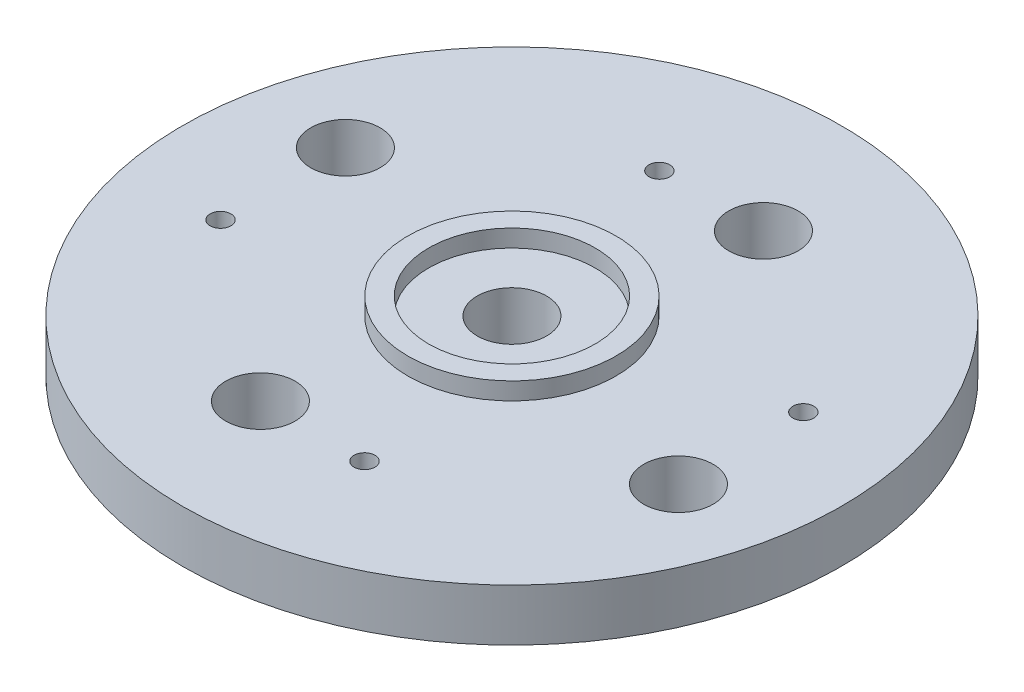
ISO-10303-21;
HEADER;
FILE_DESCRIPTION(('STEP AP214'),'2;1');
FILE_NAME('part.step','',(''),(''),'','','');
FILE_SCHEMA(('AUTOMOTIVE_DESIGN { 1 0 10303 214 1 1 1 1 }'));
ENDSEC;
DATA;
#1=APPLICATION_CONTEXT('core data for automotive mechanical design processes');
#2=APPLICATION_PROTOCOL_DEFINITION('international standard','automotive_design',2000,#1);
#3=PRODUCT_CONTEXT('',#1,'mechanical');
#4=PRODUCT('Part','Part','',(#3));
#5=PRODUCT_RELATED_PRODUCT_CATEGORY('part','',(#4));
#6=PRODUCT_DEFINITION_FORMATION('','',#4);
#7=PRODUCT_DEFINITION_CONTEXT('part definition',#1,'design');
#8=PRODUCT_DEFINITION('design','',#6,#7);
#9=PRODUCT_DEFINITION_SHAPE('','',#8);
#10=(LENGTH_UNIT() NAMED_UNIT(*) SI_UNIT(.MILLI.,.METRE.));
#11=(NAMED_UNIT(*) PLANE_ANGLE_UNIT() SI_UNIT($,.RADIAN.));
#12=(NAMED_UNIT(*) SI_UNIT($,.STERADIAN.) SOLID_ANGLE_UNIT());
#13=UNCERTAINTY_MEASURE_WITH_UNIT(LENGTH_MEASURE(1.E-05),#10,'distance_accuracy_value','');
#14=(GEOMETRIC_REPRESENTATION_CONTEXT(3) GLOBAL_UNCERTAINTY_ASSIGNED_CONTEXT((#13)) GLOBAL_UNIT_ASSIGNED_CONTEXT((#10,
#11,#12)) REPRESENTATION_CONTEXT('',''));
#15=CARTESIAN_POINT('',(0.,0.,0.));
#16=DIRECTION('',(0.,0.,1.));
#17=DIRECTION('',(1.,0.,0.));
#18=AXIS2_PLACEMENT_3D('',#15,#16,#17);
#19=CARTESIAN_POINT('',(0.,2.,0.));
#20=DIRECTION('',(0.,1.,0.));
#21=DIRECTION('',(0.,0.,1.));
#22=AXIS2_PLACEMENT_3D('',#19,#20,#21);
#23=CYLINDRICAL_SURFACE('',#22,1.);
#24=CARTESIAN_POINT('',(0.,2.,0.));
#25=DIRECTION('',(0.,1.,0.));
#26=DIRECTION('',(0.,0.,1.));
#27=AXIS2_PLACEMENT_3D('',#24,#25,#26);
#28=CIRCLE('',#27,1.);
#29=CARTESIAN_POINT('',(0.,2.,1.));
#30=VERTEX_POINT('',#29);
#31=EDGE_CURVE('E19',#30,#30,#28,.F.);
#32=ORIENTED_EDGE('',*,*,#31,.T.);
#33=EDGE_LOOP('',(#32));
#34=FACE_BOUND('',#33,.T.);
#35=CARTESIAN_POINT('',(0.,3.5,0.));
#36=DIRECTION('',(0.,1.,0.));
#37=DIRECTION('',(0.,0.,1.));
#38=AXIS2_PLACEMENT_3D('',#35,#36,#37);
#39=CIRCLE('',#38,1.);
#40=CARTESIAN_POINT('',(0.,3.5,1.));
#41=VERTEX_POINT('',#40);
#42=EDGE_CURVE('E101',#41,#41,#39,.T.);
#43=ORIENTED_EDGE('',*,*,#42,.T.);
#44=EDGE_LOOP('',(#43));
#45=FACE_BOUND('',#44,.T.);
#46=ADVANCED_FACE('F15',(#34,#45),#23,.F.);
#47=CARTESIAN_POINT('',(2.53,2.,-2.53));
#48=DIRECTION('',(0.,1.,0.));
#49=DIRECTION('',(-1.,0.,0.));
#50=AXIS2_PLACEMENT_3D('',#47,#48,#49);
#51=PLANE('',#50);
#52=ORIENTED_EDGE('',*,*,#31,.F.);
#53=EDGE_LOOP('',(#52));
#54=FACE_BOUND('',#53,.T.);
#55=CARTESIAN_POINT('',(0.,2.,0.));
#56=DIRECTION('',(0.,-1.,0.));
#57=DIRECTION('',(0.,0.,-1.));
#58=AXIS2_PLACEMENT_3D('',#55,#56,#57);
#59=CIRCLE('',#58,2.5);
#60=CARTESIAN_POINT('',(0.,2.,-2.5));
#61=VERTEX_POINT('',#60);
#62=EDGE_CURVE('E99',#61,#61,#59,.F.);
#63=ORIENTED_EDGE('',*,*,#62,.F.);
#64=EDGE_LOOP('',(#63));
#65=FACE_BOUND('',#64,.T.);
#66=ADVANCED_FACE('F109',(#54,#65),#51,.F.);
#67=CARTESIAN_POINT('',(-2.4288,3.5,-2.4288));
#68=DIRECTION('',(0.,-1.,0.));
#69=DIRECTION('',(1.,0.,0.));
#70=AXIS2_PLACEMENT_3D('',#67,#68,#69);
#71=PLANE('',#70);
#72=ORIENTED_EDGE('',*,*,#42,.F.);
#73=EDGE_LOOP('',(#72));
#74=FACE_BOUND('',#73,.T.);
#75=CARTESIAN_POINT('',(0.,3.5,0.));
#76=DIRECTION('',(0.,1.,0.));
#77=DIRECTION('',(0.,0.,1.));
#78=AXIS2_PLACEMENT_3D('',#75,#76,#77);
#79=CIRCLE('',#78,2.4);
#80=CARTESIAN_POINT('',(0.,3.5,2.4));
#81=VERTEX_POINT('',#80);
#82=EDGE_CURVE('E96',#81,#81,#79,.F.);
#83=ORIENTED_EDGE('',*,*,#82,.F.);
#84=EDGE_LOOP('',(#83));
#85=FACE_BOUND('',#84,.T.);
#86=ADVANCED_FACE('F112',(#74,#85),#71,.F.);
#87=CARTESIAN_POINT('',(0.,2.,0.));
#88=DIRECTION('',(0.,-1.,0.));
#89=DIRECTION('',(0.,0.,-1.));
#90=AXIS2_PLACEMENT_3D('',#87,#88,#89);
#91=CYLINDRICAL_SURFACE('',#90,2.5);
#92=ORIENTED_EDGE('',*,*,#62,.T.);
#93=EDGE_LOOP('',(#92));
#94=FACE_BOUND('',#93,.T.);
#95=CARTESIAN_POINT('',(0.,0.,0.));
#96=DIRECTION('',(0.,-1.,0.));
#97=DIRECTION('',(0.,0.,-1.));
#98=AXIS2_PLACEMENT_3D('',#95,#96,#97);
#99=CIRCLE('',#98,2.5);
#100=CARTESIAN_POINT('',(0.,0.,-2.5));
#101=VERTEX_POINT('',#100);
#102=EDGE_CURVE('E93',#101,#101,#99,.T.);
#103=ORIENTED_EDGE('',*,*,#102,.T.);
#104=EDGE_LOOP('',(#103));
#105=FACE_BOUND('',#104,.T.);
#106=ADVANCED_FACE('F116',(#94,#105),#91,.F.);
#107=CARTESIAN_POINT('',(0.,3.5,0.));
#108=DIRECTION('',(0.,1.,0.));
#109=DIRECTION('',(0.,0.,1.));
#110=AXIS2_PLACEMENT_3D('',#107,#108,#109);
#111=CYLINDRICAL_SURFACE('',#110,2.4);
#112=ORIENTED_EDGE('',*,*,#82,.T.);
#113=EDGE_LOOP('',(#112));
#114=FACE_BOUND('',#113,.T.);
#115=CARTESIAN_POINT('',(0.,4.,0.));
#116=DIRECTION('',(0.,1.,0.));
#117=DIRECTION('',(0.,0.,1.));
#118=AXIS2_PLACEMENT_3D('',#115,#116,#117);
#119=CIRCLE('',#118,2.4);
#120=CARTESIAN_POINT('',(0.,4.,2.4));
#121=VERTEX_POINT('',#120);
#122=EDGE_CURVE('E90',#121,#121,#119,.T.);
#123=ORIENTED_EDGE('',*,*,#122,.T.);
#124=EDGE_LOOP('',(#123));
#125=FACE_BOUND('',#124,.T.);
#126=ADVANCED_FACE('F119',(#114,#125),#111,.F.);
#127=CARTESIAN_POINT('',(3.036,0.,-3.036));
#128=DIRECTION('',(0.,1.,0.));
#129=DIRECTION('',(-1.,0.,0.));
#130=AXIS2_PLACEMENT_3D('',#127,#128,#129);
#131=PLANE('',#130);
#132=ORIENTED_EDGE('',*,*,#102,.F.);
#133=EDGE_LOOP('',(#132));
#134=FACE_BOUND('',#133,.T.);
#135=CARTESIAN_POINT('',(0.,0.,0.));
#136=DIRECTION('',(0.,1.,0.));
#137=DIRECTION('',(0.,0.,1.));
#138=AXIS2_PLACEMENT_3D('',#135,#136,#137);
#139=CIRCLE('',#138,3.);
#140=CARTESIAN_POINT('',(0.,0.,3.));
#141=VERTEX_POINT('',#140);
#142=EDGE_CURVE('E87',#141,#141,#139,.F.);
#143=ORIENTED_EDGE('',*,*,#142,.T.);
#144=EDGE_LOOP('',(#143));
#145=FACE_BOUND('',#144,.T.);
#146=ADVANCED_FACE('F123',(#134,#145),#131,.F.);
#147=CARTESIAN_POINT('',(-3.036,4.,-3.036));
#148=DIRECTION('',(0.,-1.,0.));
#149=DIRECTION('',(1.,0.,0.));
#150=AXIS2_PLACEMENT_3D('',#147,#148,#149);
#151=PLANE('',#150);
#152=ORIENTED_EDGE('',*,*,#122,.F.);
#153=EDGE_LOOP('',(#152));
#154=FACE_BOUND('',#153,.T.);
#155=CARTESIAN_POINT('',(0.,4.,0.));
#156=DIRECTION('',(0.,1.,0.));
#157=DIRECTION('',(0.,0.,1.));
#158=AXIS2_PLACEMENT_3D('',#155,#156,#157);
#159=CIRCLE('',#158,3.);
#160=CARTESIAN_POINT('',(0.,4.,3.));
#161=VERTEX_POINT('',#160);
#162=EDGE_CURVE('E84',#161,#161,#159,.T.);
#163=ORIENTED_EDGE('',*,*,#162,.T.);
#164=EDGE_LOOP('',(#163));
#165=FACE_BOUND('',#164,.T.);
#166=ADVANCED_FACE('F126',(#154,#165),#151,.F.);
#167=CARTESIAN_POINT('',(0.,0.,0.));
#168=DIRECTION('',(0.,1.,0.));
#169=DIRECTION('',(0.,0.,1.));
#170=AXIS2_PLACEMENT_3D('',#167,#168,#169);
#171=CYLINDRICAL_SURFACE('',#170,3.);
#172=CARTESIAN_POINT('',(0.,2.,0.));
#173=DIRECTION('',(0.,1.,0.));
#174=DIRECTION('',(0.,0.,1.));
#175=AXIS2_PLACEMENT_3D('',#172,#173,#174);
#176=CIRCLE('',#175,3.);
#177=CARTESIAN_POINT('',(0.,2.,3.));
#178=VERTEX_POINT('',#177);
#179=EDGE_CURVE('E57',#178,#178,#176,.F.);
#180=ORIENTED_EDGE('',*,*,#179,.T.);
#181=EDGE_LOOP('',(#180));
#182=FACE_BOUND('',#181,.T.);
#183=ORIENTED_EDGE('',*,*,#142,.F.);
#184=EDGE_LOOP('',(#183));
#185=FACE_BOUND('',#184,.T.);
#186=ADVANCED_FACE('F130',(#182,#185),#171,.T.);
#187=CARTESIAN_POINT('',(0.,2.,0.));
#188=DIRECTION('',(0.,1.,0.));
#189=DIRECTION('',(0.,0.,1.));
#190=AXIS2_PLACEMENT_3D('',#187,#188,#189);
#191=CYLINDRICAL_SURFACE('',#190,9.5);
#192=CARTESIAN_POINT('',(0.,3.5,0.));
#193=DIRECTION('',(0.,1.,0.));
#194=DIRECTION('',(0.,0.,1.));
#195=AXIS2_PLACEMENT_3D('',#192,#193,#194);
#196=CIRCLE('',#195,9.5);
#197=CARTESIAN_POINT('',(0.,3.5,9.5));
#198=VERTEX_POINT('',#197);
#199=EDGE_CURVE('E54',#198,#198,#196,.F.);
#200=ORIENTED_EDGE('',*,*,#199,.T.);
#201=EDGE_LOOP('',(#200));
#202=FACE_BOUND('',#201,.T.);
#203=CARTESIAN_POINT('',(0.,2.,0.));
#204=DIRECTION('',(0.,1.,0.));
#205=DIRECTION('',(0.,0.,1.));
#206=AXIS2_PLACEMENT_3D('',#203,#204,#205);
#207=CIRCLE('',#206,9.5);
#208=CARTESIAN_POINT('',(0.,2.,9.5));
#209=VERTEX_POINT('',#208);
#210=EDGE_CURVE('E81',#209,#209,#207,.T.);
#211=ORIENTED_EDGE('',*,*,#210,.T.);
#212=EDGE_LOOP('',(#211));
#213=FACE_BOUND('',#212,.T.);
#214=ADVANCED_FACE('F132',(#202,#213),#191,.T.);
#215=CARTESIAN_POINT('',(-1.5,2.,5.75));
#216=DIRECTION('',(0.,1.,0.));
#217=DIRECTION('',(0.,0.,1.));
#218=AXIS2_PLACEMENT_3D('',#215,#216,#217);
#219=CYLINDRICAL_SURFACE('',#218,1.);
#220=CARTESIAN_POINT('',(-1.5,2.,5.75));
#221=DIRECTION('',(0.,1.,0.));
#222=DIRECTION('',(0.,0.,1.));
#223=AXIS2_PLACEMENT_3D('',#220,#221,#222);
#224=CIRCLE('',#223,1.);
#225=CARTESIAN_POINT('',(-1.5,2.,6.75));
#226=VERTEX_POINT('',#225);
#227=EDGE_CURVE('E78',#226,#226,#224,.F.);
#228=ORIENTED_EDGE('',*,*,#227,.T.);
#229=EDGE_LOOP('',(#228));
#230=FACE_BOUND('',#229,.T.);
#231=CARTESIAN_POINT('',(-1.5,3.5,5.75));
#232=DIRECTION('',(0.,1.,0.));
#233=DIRECTION('',(0.,0.,1.));
#234=AXIS2_PLACEMENT_3D('',#231,#232,#233);
#235=CIRCLE('',#234,1.);
#236=CARTESIAN_POINT('',(-1.5,3.5,6.75));
#237=VERTEX_POINT('',#236);
#238=EDGE_CURVE('E51',#237,#237,#235,.T.);
#239=ORIENTED_EDGE('',*,*,#238,.T.);
#240=EDGE_LOOP('',(#239));
#241=FACE_BOUND('',#240,.T.);
#242=ADVANCED_FACE('F140',(#230,#241),#219,.F.);
#243=CARTESIAN_POINT('',(6.6,2.,1.8));
#244=DIRECTION('',(0.,1.,0.));
#245=DIRECTION('',(0.,0.,1.));
#246=AXIS2_PLACEMENT_3D('',#243,#244,#245);
#247=CYLINDRICAL_SURFACE('',#246,1.);
#248=CARTESIAN_POINT('',(6.6,2.,1.8));
#249=DIRECTION('',(0.,1.,0.));
#250=DIRECTION('',(0.,0.,1.));
#251=AXIS2_PLACEMENT_3D('',#248,#249,#250);
#252=CIRCLE('',#251,1.);
#253=CARTESIAN_POINT('',(6.6,2.,2.8));
#254=VERTEX_POINT('',#253);
#255=EDGE_CURVE('E75',#254,#254,#252,.F.);
#256=ORIENTED_EDGE('',*,*,#255,.T.);
#257=EDGE_LOOP('',(#256));
#258=FACE_BOUND('',#257,.T.);
#259=CARTESIAN_POINT('',(6.6,3.5,1.8));
#260=DIRECTION('',(0.,1.,0.));
#261=DIRECTION('',(0.,0.,1.));
#262=AXIS2_PLACEMENT_3D('',#259,#260,#261);
#263=CIRCLE('',#262,1.);
#264=CARTESIAN_POINT('',(6.6,3.5,2.8));
#265=VERTEX_POINT('',#264);
#266=EDGE_CURVE('E48',#265,#265,#263,.T.);
#267=ORIENTED_EDGE('',*,*,#266,.T.);
#268=EDGE_LOOP('',(#267));
#269=FACE_BOUND('',#268,.T.);
#270=ADVANCED_FACE('F179',(#258,#269),#247,.F.);
#271=CARTESIAN_POINT('',(1.5,2.,-5.75));
#272=DIRECTION('',(0.,1.,0.));
#273=DIRECTION('',(0.,0.,1.));
#274=AXIS2_PLACEMENT_3D('',#271,#272,#273);
#275=CYLINDRICAL_SURFACE('',#274,1.);
#276=CARTESIAN_POINT('',(1.5,2.,-5.75));
#277=DIRECTION('',(0.,1.,0.));
#278=DIRECTION('',(0.,0.,1.));
#279=AXIS2_PLACEMENT_3D('',#276,#277,#278);
#280=CIRCLE('',#279,1.);
#281=CARTESIAN_POINT('',(1.5,2.,-4.75));
#282=VERTEX_POINT('',#281);
#283=EDGE_CURVE('E72',#282,#282,#280,.F.);
#284=ORIENTED_EDGE('',*,*,#283,.T.);
#285=EDGE_LOOP('',(#284));
#286=FACE_BOUND('',#285,.T.);
#287=CARTESIAN_POINT('',(1.5,3.5,-5.75));
#288=DIRECTION('',(0.,1.,0.));
#289=DIRECTION('',(0.,0.,1.));
#290=AXIS2_PLACEMENT_3D('',#287,#288,#289);
#291=CIRCLE('',#290,1.);
#292=CARTESIAN_POINT('',(1.5,3.5,-4.75));
#293=VERTEX_POINT('',#292);
#294=EDGE_CURVE('E45',#293,#293,#291,.T.);
#295=ORIENTED_EDGE('',*,*,#294,.T.);
#296=EDGE_LOOP('',(#295));
#297=FACE_BOUND('',#296,.T.);
#298=ADVANCED_FACE('F175',(#286,#297),#275,.F.);
#299=CARTESIAN_POINT('',(6.6,2.,-1.8));
#300=DIRECTION('',(0.,1.,0.));
#301=DIRECTION('',(0.,0.,1.));
#302=AXIS2_PLACEMENT_3D('',#299,#300,#301);
#303=CYLINDRICAL_SURFACE('',#302,0.3);
#304=CARTESIAN_POINT('',(6.6,2.,-1.8));
#305=DIRECTION('',(0.,1.,0.));
#306=DIRECTION('',(0.,0.,1.));
#307=AXIS2_PLACEMENT_3D('',#304,#305,#306);
#308=CIRCLE('',#307,0.3);
#309=CARTESIAN_POINT('',(6.6,2.,-1.5));
#310=VERTEX_POINT('',#309);
#311=EDGE_CURVE('E69',#310,#310,#308,.F.);
#312=ORIENTED_EDGE('',*,*,#311,.T.);
#313=EDGE_LOOP('',(#312));
#314=FACE_BOUND('',#313,.T.);
#315=CARTESIAN_POINT('',(6.6,3.5,-1.8));
#316=DIRECTION('',(0.,1.,0.));
#317=DIRECTION('',(0.,0.,1.));
#318=AXIS2_PLACEMENT_3D('',#315,#316,#317);
#319=CIRCLE('',#318,0.3);
#320=CARTESIAN_POINT('',(6.6,3.5,-1.5));
#321=VERTEX_POINT('',#320);
#322=EDGE_CURVE('E42',#321,#321,#319,.T.);
#323=ORIENTED_EDGE('',*,*,#322,.T.);
#324=EDGE_LOOP('',(#323));
#325=FACE_BOUND('',#324,.T.);
#326=ADVANCED_FACE('F171',(#314,#325),#303,.F.);
#327=CARTESIAN_POINT('',(-6.6,2.,1.8));
#328=DIRECTION('',(0.,1.,0.));
#329=DIRECTION('',(0.,0.,1.));
#330=AXIS2_PLACEMENT_3D('',#327,#328,#329);
#331=CYLINDRICAL_SURFACE('',#330,0.300000000000001);
#332=CARTESIAN_POINT('',(-6.6,2.,1.8));
#333=DIRECTION('',(0.,1.,0.));
#334=DIRECTION('',(0.,0.,1.));
#335=AXIS2_PLACEMENT_3D('',#332,#333,#334);
#336=CIRCLE('',#335,0.300000000000001);
#337=CARTESIAN_POINT('',(-6.6,2.,2.1));
#338=VERTEX_POINT('',#337);
#339=EDGE_CURVE('E66',#338,#338,#336,.F.);
#340=ORIENTED_EDGE('',*,*,#339,.T.);
#341=EDGE_LOOP('',(#340));
#342=FACE_BOUND('',#341,.T.);
#343=CARTESIAN_POINT('',(-6.6,3.5,1.8));
#344=DIRECTION('',(0.,1.,0.));
#345=DIRECTION('',(0.,0.,1.));
#346=AXIS2_PLACEMENT_3D('',#343,#344,#345);
#347=CIRCLE('',#346,0.300000000000001);
#348=CARTESIAN_POINT('',(-6.6,3.5,2.1));
#349=VERTEX_POINT('',#348);
#350=EDGE_CURVE('E39',#349,#349,#347,.T.);
#351=ORIENTED_EDGE('',*,*,#350,.T.);
#352=EDGE_LOOP('',(#351));
#353=FACE_BOUND('',#352,.T.);
#354=ADVANCED_FACE('F167',(#342,#353),#331,.F.);
#355=CARTESIAN_POINT('',(1.5,2.,5.75));
#356=DIRECTION('',(0.,1.,0.));
#357=DIRECTION('',(0.,0.,1.));
#358=AXIS2_PLACEMENT_3D('',#355,#356,#357);
#359=CYLINDRICAL_SURFACE('',#358,0.3);
#360=CARTESIAN_POINT('',(1.5,2.,5.75));
#361=DIRECTION('',(0.,1.,0.));
#362=DIRECTION('',(0.,0.,1.));
#363=AXIS2_PLACEMENT_3D('',#360,#361,#362);
#364=CIRCLE('',#363,0.3);
#365=CARTESIAN_POINT('',(1.5,2.,6.05));
#366=VERTEX_POINT('',#365);
#367=EDGE_CURVE('E63',#366,#366,#364,.F.);
#368=ORIENTED_EDGE('',*,*,#367,.T.);
#369=EDGE_LOOP('',(#368));
#370=FACE_BOUND('',#369,.T.);
#371=CARTESIAN_POINT('',(1.5,3.5,5.75));
#372=DIRECTION('',(0.,1.,0.));
#373=DIRECTION('',(0.,0.,1.));
#374=AXIS2_PLACEMENT_3D('',#371,#372,#373);
#375=CIRCLE('',#374,0.3);
#376=CARTESIAN_POINT('',(1.5,3.5,6.05));
#377=VERTEX_POINT('',#376);
#378=EDGE_CURVE('E36',#377,#377,#375,.T.);
#379=ORIENTED_EDGE('',*,*,#378,.T.);
#380=EDGE_LOOP('',(#379));
#381=FACE_BOUND('',#380,.T.);
#382=ADVANCED_FACE('F163',(#370,#381),#359,.F.);
#383=CARTESIAN_POINT('',(-1.5,2.,-5.75));
#384=DIRECTION('',(0.,1.,0.));
#385=DIRECTION('',(0.,0.,1.));
#386=AXIS2_PLACEMENT_3D('',#383,#384,#385);
#387=CYLINDRICAL_SURFACE('',#386,0.3);
#388=CARTESIAN_POINT('',(-1.5,2.,-5.75));
#389=DIRECTION('',(0.,1.,0.));
#390=DIRECTION('',(0.,0.,1.));
#391=AXIS2_PLACEMENT_3D('',#388,#389,#390);
#392=CIRCLE('',#391,0.3);
#393=CARTESIAN_POINT('',(-1.5,2.,-5.45));
#394=VERTEX_POINT('',#393);
#395=EDGE_CURVE('E60',#394,#394,#392,.F.);
#396=ORIENTED_EDGE('',*,*,#395,.T.);
#397=EDGE_LOOP('',(#396));
#398=FACE_BOUND('',#397,.T.);
#399=CARTESIAN_POINT('',(-1.5,3.5,-5.75));
#400=DIRECTION('',(0.,1.,0.));
#401=DIRECTION('',(0.,0.,1.));
#402=AXIS2_PLACEMENT_3D('',#399,#400,#401);
#403=CIRCLE('',#402,0.3);
#404=CARTESIAN_POINT('',(-1.5,3.5,-5.45));
#405=VERTEX_POINT('',#404);
#406=EDGE_CURVE('E33',#405,#405,#403,.T.);
#407=ORIENTED_EDGE('',*,*,#406,.T.);
#408=EDGE_LOOP('',(#407));
#409=FACE_BOUND('',#408,.T.);
#410=ADVANCED_FACE('F159',(#398,#409),#387,.F.);
#411=CARTESIAN_POINT('',(0.,3.5,0.));
#412=DIRECTION('',(0.,1.,0.));
#413=DIRECTION('',(0.,0.,1.));
#414=AXIS2_PLACEMENT_3D('',#411,#412,#413);
#415=CYLINDRICAL_SURFACE('',#414,3.);
#416=ORIENTED_EDGE('',*,*,#162,.F.);
#417=EDGE_LOOP('',(#416));
#418=FACE_BOUND('',#417,.T.);
#419=CARTESIAN_POINT('',(0.,3.5,0.));
#420=DIRECTION('',(0.,1.,0.));
#421=DIRECTION('',(0.,0.,1.));
#422=AXIS2_PLACEMENT_3D('',#419,#420,#421);
#423=CIRCLE('',#422,3.);
#424=CARTESIAN_POINT('',(0.,3.5,3.));
#425=VERTEX_POINT('',#424);
#426=EDGE_CURVE('E28',#425,#425,#423,.T.);
#427=ORIENTED_EDGE('',*,*,#426,.T.);
#428=EDGE_LOOP('',(#427));
#429=FACE_BOUND('',#428,.T.);
#430=ADVANCED_FACE('F156',(#418,#429),#415,.T.);
#431=CARTESIAN_POINT('',(9.614,2.,-9.614));
#432=DIRECTION('',(0.,1.,0.));
#433=DIRECTION('',(-1.,0.,0.));
#434=AXIS2_PLACEMENT_3D('',#431,#432,#433);
#435=PLANE('',#434);
#436=ORIENTED_EDGE('',*,*,#179,.F.);
#437=EDGE_LOOP('',(#436));
#438=FACE_BOUND('',#437,.T.);
#439=ORIENTED_EDGE('',*,*,#395,.F.);
#440=EDGE_LOOP('',(#439));
#441=FACE_BOUND('',#440,.T.);
#442=ORIENTED_EDGE('',*,*,#367,.F.);
#443=EDGE_LOOP('',(#442));
#444=FACE_BOUND('',#443,.T.);
#445=ORIENTED_EDGE('',*,*,#339,.F.);
#446=EDGE_LOOP('',(#445));
#447=FACE_BOUND('',#446,.T.);
#448=ORIENTED_EDGE('',*,*,#311,.F.);
#449=EDGE_LOOP('',(#448));
#450=FACE_BOUND('',#449,.T.);
#451=ORIENTED_EDGE('',*,*,#283,.F.);
#452=EDGE_LOOP('',(#451));
#453=FACE_BOUND('',#452,.T.);
#454=ORIENTED_EDGE('',*,*,#255,.F.);
#455=EDGE_LOOP('',(#454));
#456=FACE_BOUND('',#455,.T.);
#457=ORIENTED_EDGE('',*,*,#227,.F.);
#458=EDGE_LOOP('',(#457));
#459=FACE_BOUND('',#458,.T.);
#460=CARTESIAN_POINT('',(-6.6,2.,-1.8));
#461=DIRECTION('',(0.,1.,0.));
#462=DIRECTION('',(0.,0.,1.));
#463=AXIS2_PLACEMENT_3D('',#460,#461,#462);
#464=CIRCLE('',#463,1.);
#465=CARTESIAN_POINT('',(-6.6,2.,-0.8));
#466=VERTEX_POINT('',#465);
#467=EDGE_CURVE('E23',#466,#466,#464,.F.);
#468=ORIENTED_EDGE('',*,*,#467,.F.);
#469=EDGE_LOOP('',(#468));
#470=FACE_BOUND('',#469,.T.);
#471=ORIENTED_EDGE('',*,*,#210,.F.);
#472=EDGE_LOOP('',(#471));
#473=FACE_BOUND('',#472,.T.);
#474=ADVANCED_FACE('F153',(#438,#441,#444,#447,#450,#453,#456,#459,#470,#473),#435,.F.);
#475=CARTESIAN_POINT('',(-9.614,3.5,-9.614));
#476=DIRECTION('',(0.,-1.,0.));
#477=DIRECTION('',(1.,0.,0.));
#478=AXIS2_PLACEMENT_3D('',#475,#476,#477);
#479=PLANE('',#478);
#480=ORIENTED_EDGE('',*,*,#426,.F.);
#481=EDGE_LOOP('',(#480));
#482=FACE_BOUND('',#481,.T.);
#483=ORIENTED_EDGE('',*,*,#406,.F.);
#484=EDGE_LOOP('',(#483));
#485=FACE_BOUND('',#484,.T.);
#486=ORIENTED_EDGE('',*,*,#378,.F.);
#487=EDGE_LOOP('',(#486));
#488=FACE_BOUND('',#487,.T.);
#489=ORIENTED_EDGE('',*,*,#350,.F.);
#490=EDGE_LOOP('',(#489));
#491=FACE_BOUND('',#490,.T.);
#492=ORIENTED_EDGE('',*,*,#322,.F.);
#493=EDGE_LOOP('',(#492));
#494=FACE_BOUND('',#493,.T.);
#495=ORIENTED_EDGE('',*,*,#294,.F.);
#496=EDGE_LOOP('',(#495));
#497=FACE_BOUND('',#496,.T.);
#498=ORIENTED_EDGE('',*,*,#266,.F.);
#499=EDGE_LOOP('',(#498));
#500=FACE_BOUND('',#499,.T.);
#501=ORIENTED_EDGE('',*,*,#238,.F.);
#502=EDGE_LOOP('',(#501));
#503=FACE_BOUND('',#502,.T.);
#504=CARTESIAN_POINT('',(-6.6,3.5,-1.8));
#505=DIRECTION('',(0.,1.,0.));
#506=DIRECTION('',(0.,0.,1.));
#507=AXIS2_PLACEMENT_3D('',#504,#505,#506);
#508=CIRCLE('',#507,1.);
#509=CARTESIAN_POINT('',(-6.6,3.5,-0.8));
#510=VERTEX_POINT('',#509);
#511=EDGE_CURVE('E10',#510,#510,#508,.T.);
#512=ORIENTED_EDGE('',*,*,#511,.F.);
#513=EDGE_LOOP('',(#512));
#514=FACE_BOUND('',#513,.T.);
#515=ORIENTED_EDGE('',*,*,#199,.F.);
#516=EDGE_LOOP('',(#515));
#517=FACE_BOUND('',#516,.T.);
#518=ADVANCED_FACE('F17',(#482,#485,#488,#491,#494,#497,#500,#503,#514,#517),#479,.F.);
#519=CARTESIAN_POINT('',(-6.6,2.,-1.8));
#520=DIRECTION('',(0.,1.,0.));
#521=DIRECTION('',(0.,0.,1.));
#522=AXIS2_PLACEMENT_3D('',#519,#520,#521);
#523=CYLINDRICAL_SURFACE('',#522,1.);
#524=ORIENTED_EDGE('',*,*,#467,.T.);
#525=EDGE_LOOP('',(#524));
#526=FACE_BOUND('',#525,.T.);
#527=ORIENTED_EDGE('',*,*,#511,.T.);
#528=EDGE_LOOP('',(#527));
#529=FACE_BOUND('',#528,.T.);
#530=ADVANCED_FACE('F146',(#526,#529),#523,.F.);
#531=CLOSED_SHELL('',(#46,#66,#86,#106,#126,#146,#166,#186,#214,#242,#270,#298,#326,#354,#382,
#410,#430,#474,#518,#530));
#532=MANIFOLD_SOLID_BREP('B1',#531);
#533=ADVANCED_BREP_SHAPE_REPRESENTATION('',(#18,#532),#14);
#534=SHAPE_DEFINITION_REPRESENTATION(#9,#533);
ENDSEC;
END-ISO-10303-21;
